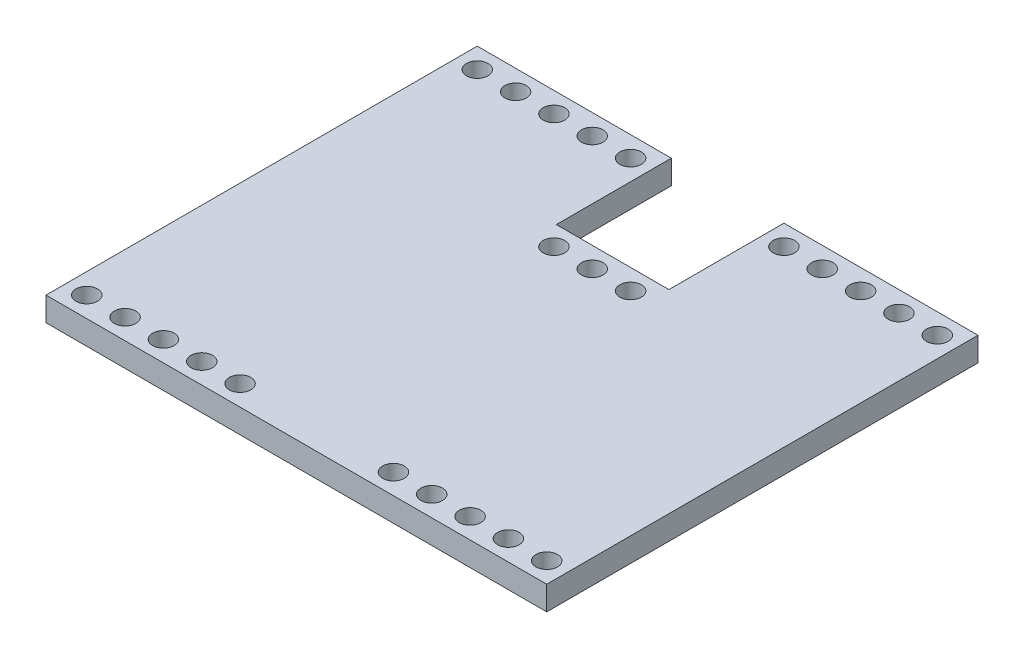
ISO-10303-21;
HEADER;
FILE_DESCRIPTION(('STEP AP214'),'2;1');
FILE_NAME('part.step','',(''),(''),'','','');
FILE_SCHEMA(('AUTOMOTIVE_DESIGN { 1 0 10303 214 1 1 1 1 }'));
ENDSEC;
DATA;
#1=APPLICATION_CONTEXT('core data for automotive mechanical design processes');
#2=APPLICATION_PROTOCOL_DEFINITION('international standard','automotive_design',2000,#1);
#3=PRODUCT_CONTEXT('',#1,'mechanical');
#4=PRODUCT('Part','Part','',(#3));
#5=PRODUCT_RELATED_PRODUCT_CATEGORY('part','',(#4));
#6=PRODUCT_DEFINITION_FORMATION('','',#4);
#7=PRODUCT_DEFINITION_CONTEXT('part definition',#1,'design');
#8=PRODUCT_DEFINITION('design','',#6,#7);
#9=PRODUCT_DEFINITION_SHAPE('','',#8);
#10=(LENGTH_UNIT() NAMED_UNIT(*) SI_UNIT(.MILLI.,.METRE.));
#11=(NAMED_UNIT(*) PLANE_ANGLE_UNIT() SI_UNIT($,.RADIAN.));
#12=(NAMED_UNIT(*) SI_UNIT($,.STERADIAN.) SOLID_ANGLE_UNIT());
#13=UNCERTAINTY_MEASURE_WITH_UNIT(LENGTH_MEASURE(1.E-05),#10,'distance_accuracy_value','');
#14=(GEOMETRIC_REPRESENTATION_CONTEXT(3) GLOBAL_UNCERTAINTY_ASSIGNED_CONTEXT((#13)) GLOBAL_UNIT_ASSIGNED_CONTEXT((#10,
#11,#12)) REPRESENTATION_CONTEXT('',''));
#15=CARTESIAN_POINT('',(0.,0.,0.));
#16=DIRECTION('',(0.,0.,1.));
#17=DIRECTION('',(1.,0.,0.));
#18=AXIS2_PLACEMENT_3D('',#15,#16,#17);
#19=CARTESIAN_POINT('',(11.75,5.,0.));
#20=DIRECTION('',(-1.,0.,0.));
#21=DIRECTION('',(0.,0.,1.));
#22=AXIS2_PLACEMENT_3D('',#19,#20,#21);
#23=PLANE('',#22);
#24=DIRECTION('',(0.,0.,-1.));
#25=VECTOR('',#24,1.);
#26=CARTESIAN_POINT('',(11.75,0.,0.));
#27=LINE('',#26,#25);
#28=CARTESIAN_POINT('',(11.75,0.,-21.));
#29=VERTEX_POINT('',#28);
#30=CARTESIAN_POINT('',(11.75,0.,-45.));
#31=VERTEX_POINT('',#30);
#32=EDGE_CURVE('E202',#29,#31,#27,.T.);
#33=ORIENTED_EDGE('',*,*,#32,.F.);
#34=DIRECTION('',(0.,-1.,0.));
#35=VECTOR('',#34,1.);
#36=CARTESIAN_POINT('',(11.75,5.,-21.));
#37=LINE('',#36,#35);
#38=CARTESIAN_POINT('',(11.75,5.,-21.));
#39=VERTEX_POINT('',#38);
#40=EDGE_CURVE('E11',#39,#29,#37,.T.);
#41=ORIENTED_EDGE('',*,*,#40,.F.);
#42=DIRECTION('',(0.,0.,-1.));
#43=VECTOR('',#42,1.);
#44=CARTESIAN_POINT('',(11.75,5.,0.));
#45=LINE('',#44,#43);
#46=CARTESIAN_POINT('',(11.75,5.,-45.));
#47=VERTEX_POINT('',#46);
#48=EDGE_CURVE('E707',#39,#47,#45,.T.);
#49=ORIENTED_EDGE('',*,*,#48,.T.);
#50=DIRECTION('',(0.,-1.,0.));
#51=VECTOR('',#50,1.);
#52=CARTESIAN_POINT('',(11.75,5.,-45.));
#53=LINE('',#52,#51);
#54=EDGE_CURVE('E54',#47,#31,#53,.T.);
#55=ORIENTED_EDGE('',*,*,#54,.T.);
#56=EDGE_LOOP('',(#33,#41,#49,#55));
#57=FACE_BOUND('',#56,.T.);
#58=ADVANCED_FACE('F37',(#57),#23,.T.);
#59=CARTESIAN_POINT('',(0.,5.,-21.));
#60=DIRECTION('',(0.,0.,-1.));
#61=DIRECTION('',(-1.,0.,0.));
#62=AXIS2_PLACEMENT_3D('',#59,#60,#61);
#63=PLANE('',#62);
#64=DIRECTION('',(1.,0.,0.));
#65=VECTOR('',#64,1.);
#66=CARTESIAN_POINT('',(0.,0.,-21.));
#67=LINE('',#66,#65);
#68=CARTESIAN_POINT('',(-11.75,0.,-21.));
#69=VERTEX_POINT('',#68);
#70=EDGE_CURVE('E204',#69,#29,#67,.T.);
#71=ORIENTED_EDGE('',*,*,#70,.F.);
#72=DIRECTION('',(0.,-1.,0.));
#73=VECTOR('',#72,1.);
#74=CARTESIAN_POINT('',(-11.75,5.,-21.));
#75=LINE('',#74,#73);
#76=CARTESIAN_POINT('',(-11.75,5.,-21.));
#77=VERTEX_POINT('',#76);
#78=EDGE_CURVE('E46',#77,#69,#75,.T.);
#79=ORIENTED_EDGE('',*,*,#78,.F.);
#80=DIRECTION('',(1.,0.,0.));
#81=VECTOR('',#80,1.);
#82=CARTESIAN_POINT('',(0.,5.,-21.));
#83=LINE('',#82,#81);
#84=EDGE_CURVE('E291',#77,#39,#83,.T.);
#85=ORIENTED_EDGE('',*,*,#84,.T.);
#86=ORIENTED_EDGE('',*,*,#40,.T.);
#87=EDGE_LOOP('',(#71,#79,#85,#86));
#88=FACE_BOUND('',#87,.T.);
#89=ADVANCED_FACE('F290',(#88),#63,.T.);
#90=CARTESIAN_POINT('',(-11.75,5.,0.));
#91=DIRECTION('',(-1.,0.,0.));
#92=DIRECTION('',(0.,0.,1.));
#93=AXIS2_PLACEMENT_3D('',#90,#91,#92);
#94=PLANE('',#93);
#95=DIRECTION('',(0.,0.,-1.));
#96=VECTOR('',#95,1.);
#97=CARTESIAN_POINT('',(-11.75,0.,0.));
#98=LINE('',#97,#96);
#99=CARTESIAN_POINT('',(-11.75,0.,-45.));
#100=VERTEX_POINT('',#99);
#101=EDGE_CURVE('E207',#69,#100,#98,.T.);
#102=ORIENTED_EDGE('',*,*,#101,.T.);
#103=DIRECTION('',(0.,-1.,0.));
#104=VECTOR('',#103,1.);
#105=CARTESIAN_POINT('',(-11.75,5.,-45.));
#106=LINE('',#105,#104);
#107=CARTESIAN_POINT('',(-11.75,5.,-45.));
#108=VERTEX_POINT('',#107);
#109=EDGE_CURVE('E274',#108,#100,#106,.T.);
#110=ORIENTED_EDGE('',*,*,#109,.F.);
#111=DIRECTION('',(0.,0.,-1.));
#112=VECTOR('',#111,1.);
#113=CARTESIAN_POINT('',(-11.75,5.,0.));
#114=LINE('',#113,#112);
#115=EDGE_CURVE('E280',#77,#108,#114,.T.);
#116=ORIENTED_EDGE('',*,*,#115,.F.);
#117=ORIENTED_EDGE('',*,*,#78,.T.);
#118=EDGE_LOOP('',(#102,#110,#116,#117));
#119=FACE_BOUND('',#118,.T.);
#120=ADVANCED_FACE('F278',(#119),#94,.F.);
#121=CARTESIAN_POINT('',(0.,5.,-45.));
#122=DIRECTION('',(0.,0.,-1.));
#123=DIRECTION('',(-1.,0.,0.));
#124=AXIS2_PLACEMENT_3D('',#121,#122,#123);
#125=PLANE('',#124);
#126=DIRECTION('',(1.,0.,0.));
#127=VECTOR('',#126,1.);
#128=CARTESIAN_POINT('',(0.,0.,-45.));
#129=LINE('',#128,#127);
#130=CARTESIAN_POINT('',(-52.25,0.,-45.));
#131=VERTEX_POINT('',#130);
#132=EDGE_CURVE('E210',#131,#100,#129,.T.);
#133=ORIENTED_EDGE('',*,*,#132,.F.);
#134=DIRECTION('',(0.,-1.,0.));
#135=VECTOR('',#134,1.);
#136=CARTESIAN_POINT('',(-52.25,5.,-45.));
#137=LINE('',#136,#135);
#138=CARTESIAN_POINT('',(-52.25,5.,-45.));
#139=VERTEX_POINT('',#138);
#140=EDGE_CURVE('E272',#139,#131,#137,.T.);
#141=ORIENTED_EDGE('',*,*,#140,.F.);
#142=DIRECTION('',(1.,0.,0.));
#143=VECTOR('',#142,1.);
#144=CARTESIAN_POINT('',(0.,5.,-45.));
#145=LINE('',#144,#143);
#146=EDGE_CURVE('E131',#139,#108,#145,.T.);
#147=ORIENTED_EDGE('',*,*,#146,.T.);
#148=ORIENTED_EDGE('',*,*,#109,.T.);
#149=EDGE_LOOP('',(#133,#141,#147,#148));
#150=FACE_BOUND('',#149,.T.);
#151=ADVANCED_FACE('F298',(#150),#125,.T.);
#152=CARTESIAN_POINT('',(-52.25,5.,0.));
#153=DIRECTION('',(1.,0.,0.));
#154=DIRECTION('',(0.,0.,-1.));
#155=AXIS2_PLACEMENT_3D('',#152,#153,#154);
#156=PLANE('',#155);
#157=DIRECTION('',(0.,0.,1.));
#158=VECTOR('',#157,1.);
#159=CARTESIAN_POINT('',(-52.25,0.,0.));
#160=LINE('',#159,#158);
#161=CARTESIAN_POINT('',(-52.25,0.,45.));
#162=VERTEX_POINT('',#161);
#163=EDGE_CURVE('E213',#131,#162,#160,.T.);
#164=ORIENTED_EDGE('',*,*,#163,.T.);
#165=DIRECTION('',(0.,-1.,0.));
#166=VECTOR('',#165,1.);
#167=CARTESIAN_POINT('',(-52.25,5.,45.));
#168=LINE('',#167,#166);
#169=CARTESIAN_POINT('',(-52.25,5.,45.));
#170=VERTEX_POINT('',#169);
#171=EDGE_CURVE('E124',#170,#162,#168,.T.);
#172=ORIENTED_EDGE('',*,*,#171,.F.);
#173=DIRECTION('',(0.,0.,1.));
#174=VECTOR('',#173,1.);
#175=CARTESIAN_POINT('',(-52.25,5.,0.));
#176=LINE('',#175,#174);
#177=EDGE_CURVE('E113',#139,#170,#176,.T.);
#178=ORIENTED_EDGE('',*,*,#177,.F.);
#179=ORIENTED_EDGE('',*,*,#140,.T.);
#180=EDGE_LOOP('',(#164,#172,#178,#179));
#181=FACE_BOUND('',#180,.T.);
#182=ADVANCED_FACE('F311',(#181),#156,.F.);
#183=CARTESIAN_POINT('',(0.,5.,45.));
#184=DIRECTION('',(0.,0.,-1.));
#185=DIRECTION('',(-1.,0.,0.));
#186=AXIS2_PLACEMENT_3D('',#183,#184,#185);
#187=PLANE('',#186);
#188=DIRECTION('',(1.,0.,0.));
#189=VECTOR('',#188,1.);
#190=CARTESIAN_POINT('',(0.,0.,45.));
#191=LINE('',#190,#189);
#192=CARTESIAN_POINT('',(52.25,0.,45.));
#193=VERTEX_POINT('',#192);
#194=EDGE_CURVE('E121',#162,#193,#191,.T.);
#195=ORIENTED_EDGE('',*,*,#194,.T.);
#196=DIRECTION('',(0.,-1.,0.));
#197=VECTOR('',#196,1.);
#198=CARTESIAN_POINT('',(52.25,5.,45.));
#199=LINE('',#198,#197);
#200=CARTESIAN_POINT('',(52.25,5.,45.));
#201=VERTEX_POINT('',#200);
#202=EDGE_CURVE('E119',#201,#193,#199,.T.);
#203=ORIENTED_EDGE('',*,*,#202,.F.);
#204=DIRECTION('',(1.,0.,0.));
#205=VECTOR('',#204,1.);
#206=CARTESIAN_POINT('',(0.,5.,45.));
#207=LINE('',#206,#205);
#208=EDGE_CURVE('E104',#170,#201,#207,.T.);
#209=ORIENTED_EDGE('',*,*,#208,.F.);
#210=ORIENTED_EDGE('',*,*,#171,.T.);
#211=EDGE_LOOP('',(#195,#203,#209,#210));
#212=FACE_BOUND('',#211,.T.);
#213=ADVANCED_FACE('F120',(#212),#187,.F.);
#214=CARTESIAN_POINT('',(52.25,5.,0.));
#215=DIRECTION('',(1.,0.,0.));
#216=DIRECTION('',(0.,0.,-1.));
#217=AXIS2_PLACEMENT_3D('',#214,#215,#216);
#218=PLANE('',#217);
#219=DIRECTION('',(0.,0.,1.));
#220=VECTOR('',#219,1.);
#221=CARTESIAN_POINT('',(52.25,0.,0.));
#222=LINE('',#221,#220);
#223=CARTESIAN_POINT('',(52.25,0.,-45.));
#224=VERTEX_POINT('',#223);
#225=EDGE_CURVE('E218',#224,#193,#222,.T.);
#226=ORIENTED_EDGE('',*,*,#225,.F.);
#227=DIRECTION('',(0.,-1.,0.));
#228=VECTOR('',#227,1.);
#229=CARTESIAN_POINT('',(52.25,5.,-45.));
#230=LINE('',#229,#228);
#231=CARTESIAN_POINT('',(52.25,5.,-45.));
#232=VERTEX_POINT('',#231);
#233=EDGE_CURVE('E79',#232,#224,#230,.T.);
#234=ORIENTED_EDGE('',*,*,#233,.F.);
#235=DIRECTION('',(0.,0.,1.));
#236=VECTOR('',#235,1.);
#237=CARTESIAN_POINT('',(52.25,5.,0.));
#238=LINE('',#237,#236);
#239=EDGE_CURVE('E110',#232,#201,#238,.T.);
#240=ORIENTED_EDGE('',*,*,#239,.T.);
#241=ORIENTED_EDGE('',*,*,#202,.T.);
#242=EDGE_LOOP('',(#226,#234,#240,#241));
#243=FACE_BOUND('',#242,.T.);
#244=ADVANCED_FACE('F126',(#243),#218,.T.);
#245=CARTESIAN_POINT('',(-32.,5.,40.75));
#246=DIRECTION('',(0.,-1.,0.));
#247=DIRECTION('',(0.,0.,-1.));
#248=AXIS2_PLACEMENT_3D('',#245,#246,#247);
#249=CYLINDRICAL_SURFACE('',#248,2.25);
#250=CARTESIAN_POINT('',(-32.,5.,40.75));
#251=DIRECTION('',(0.,1.,0.));
#252=DIRECTION('',(0.,0.,1.));
#253=AXIS2_PLACEMENT_3D('',#250,#251,#252);
#254=CIRCLE('',#253,2.25);
#255=CARTESIAN_POINT('',(-32.,5.,43.));
#256=VERTEX_POINT('',#255);
#257=EDGE_CURVE('E175',#256,#256,#254,.F.);
#258=ORIENTED_EDGE('',*,*,#257,.F.);
#259=EDGE_LOOP('',(#258));
#260=FACE_BOUND('',#259,.T.);
#261=CARTESIAN_POINT('',(-32.,0.,40.75));
#262=DIRECTION('',(0.,1.,0.));
#263=DIRECTION('',(0.,0.,1.));
#264=AXIS2_PLACEMENT_3D('',#261,#262,#263);
#265=CIRCLE('',#264,2.25);
#266=CARTESIAN_POINT('',(-32.,0.,43.));
#267=VERTEX_POINT('',#266);
#268=EDGE_CURVE('E262',#267,#267,#265,.F.);
#269=ORIENTED_EDGE('',*,*,#268,.T.);
#270=EDGE_LOOP('',(#269));
#271=FACE_BOUND('',#270,.T.);
#272=ADVANCED_FACE('F377',(#260,#271),#249,.F.);
#273=CARTESIAN_POINT('',(-16.,5.,40.75));
#274=DIRECTION('',(0.,-1.,0.));
#275=DIRECTION('',(0.,0.,-1.));
#276=AXIS2_PLACEMENT_3D('',#273,#274,#275);
#277=CYLINDRICAL_SURFACE('',#276,2.25);
#278=CARTESIAN_POINT('',(-16.,5.,40.75));
#279=DIRECTION('',(0.,1.,0.));
#280=DIRECTION('',(0.,0.,1.));
#281=AXIS2_PLACEMENT_3D('',#278,#279,#280);
#282=CIRCLE('',#281,2.25);
#283=CARTESIAN_POINT('',(-16.,5.,43.));
#284=VERTEX_POINT('',#283);
#285=EDGE_CURVE('E172',#284,#284,#282,.F.);
#286=ORIENTED_EDGE('',*,*,#285,.F.);
#287=EDGE_LOOP('',(#286));
#288=FACE_BOUND('',#287,.T.);
#289=CARTESIAN_POINT('',(-16.,0.,40.75));
#290=DIRECTION('',(0.,1.,0.));
#291=DIRECTION('',(0.,0.,1.));
#292=AXIS2_PLACEMENT_3D('',#289,#290,#291);
#293=CIRCLE('',#292,2.25);
#294=CARTESIAN_POINT('',(-16.,0.,43.));
#295=VERTEX_POINT('',#294);
#296=EDGE_CURVE('E259',#295,#295,#293,.F.);
#297=ORIENTED_EDGE('',*,*,#296,.T.);
#298=EDGE_LOOP('',(#297));
#299=FACE_BOUND('',#298,.T.);
#300=ADVANCED_FACE('F380',(#288,#299),#277,.F.);
#301=CARTESIAN_POINT('',(15.9999999999999,5.,40.75));
#302=DIRECTION('',(0.,-1.,0.));
#303=DIRECTION('',(0.,0.,-1.));
#304=AXIS2_PLACEMENT_3D('',#301,#302,#303);
#305=CYLINDRICAL_SURFACE('',#304,2.25);
#306=CARTESIAN_POINT('',(15.9999999999999,5.,40.75));
#307=DIRECTION('',(0.,1.,0.));
#308=DIRECTION('',(0.,0.,1.));
#309=AXIS2_PLACEMENT_3D('',#306,#307,#308);
#310=CIRCLE('',#309,2.25);
#311=CARTESIAN_POINT('',(15.9999999999999,5.,43.));
#312=VERTEX_POINT('',#311);
#313=EDGE_CURVE('E169',#312,#312,#310,.T.);
#314=ORIENTED_EDGE('',*,*,#313,.T.);
#315=EDGE_LOOP('',(#314));
#316=FACE_BOUND('',#315,.T.);
#317=CARTESIAN_POINT('',(15.9999999999999,0.,40.75));
#318=DIRECTION('',(0.,1.,0.));
#319=DIRECTION('',(0.,0.,1.));
#320=AXIS2_PLACEMENT_3D('',#317,#318,#319);
#321=CIRCLE('',#320,2.25);
#322=CARTESIAN_POINT('',(15.9999999999999,0.,43.));
#323=VERTEX_POINT('',#322);
#324=EDGE_CURVE('E256',#323,#323,#321,.T.);
#325=ORIENTED_EDGE('',*,*,#324,.F.);
#326=EDGE_LOOP('',(#325));
#327=FACE_BOUND('',#326,.T.);
#328=ADVANCED_FACE('F384',(#316,#327),#305,.F.);
#329=CARTESIAN_POINT('',(23.9999999999999,5.,40.75));
#330=DIRECTION('',(0.,-1.,0.));
#331=DIRECTION('',(0.,0.,-1.));
#332=AXIS2_PLACEMENT_3D('',#329,#330,#331);
#333=CYLINDRICAL_SURFACE('',#332,2.25);
#334=CARTESIAN_POINT('',(23.9999999999999,5.,40.75));
#335=DIRECTION('',(0.,1.,0.));
#336=DIRECTION('',(0.,0.,1.));
#337=AXIS2_PLACEMENT_3D('',#334,#335,#336);
#338=CIRCLE('',#337,2.25);
#339=CARTESIAN_POINT('',(23.9999999999999,5.,43.));
#340=VERTEX_POINT('',#339);
#341=EDGE_CURVE('E166',#340,#340,#338,.T.);
#342=ORIENTED_EDGE('',*,*,#341,.T.);
#343=EDGE_LOOP('',(#342));
#344=FACE_BOUND('',#343,.T.);
#345=CARTESIAN_POINT('',(23.9999999999999,0.,40.75));
#346=DIRECTION('',(0.,1.,0.));
#347=DIRECTION('',(0.,0.,1.));
#348=AXIS2_PLACEMENT_3D('',#345,#346,#347);
#349=CIRCLE('',#348,2.25);
#350=CARTESIAN_POINT('',(23.9999999999999,0.,43.));
#351=VERTEX_POINT('',#350);
#352=EDGE_CURVE('E253',#351,#351,#349,.T.);
#353=ORIENTED_EDGE('',*,*,#352,.F.);
#354=EDGE_LOOP('',(#353));
#355=FACE_BOUND('',#354,.T.);
#356=ADVANCED_FACE('F388',(#344,#355),#333,.F.);
#357=CARTESIAN_POINT('',(31.9999999999999,5.,40.75));
#358=DIRECTION('',(0.,-1.,0.));
#359=DIRECTION('',(0.,0.,-1.));
#360=AXIS2_PLACEMENT_3D('',#357,#358,#359);
#361=CYLINDRICAL_SURFACE('',#360,2.25);
#362=CARTESIAN_POINT('',(31.9999999999999,5.,40.75));
#363=DIRECTION('',(0.,1.,0.));
#364=DIRECTION('',(0.,0.,1.));
#365=AXIS2_PLACEMENT_3D('',#362,#363,#364);
#366=CIRCLE('',#365,2.25);
#367=CARTESIAN_POINT('',(31.9999999999999,5.,43.));
#368=VERTEX_POINT('',#367);
#369=EDGE_CURVE('E163',#368,#368,#366,.T.);
#370=ORIENTED_EDGE('',*,*,#369,.T.);
#371=EDGE_LOOP('',(#370));
#372=FACE_BOUND('',#371,.T.);
#373=CARTESIAN_POINT('',(31.9999999999999,0.,40.75));
#374=DIRECTION('',(0.,1.,0.));
#375=DIRECTION('',(0.,0.,1.));
#376=AXIS2_PLACEMENT_3D('',#373,#374,#375);
#377=CIRCLE('',#376,2.25);
#378=CARTESIAN_POINT('',(31.9999999999999,0.,43.));
#379=VERTEX_POINT('',#378);
#380=EDGE_CURVE('E250',#379,#379,#377,.T.);
#381=ORIENTED_EDGE('',*,*,#380,.F.);
#382=EDGE_LOOP('',(#381));
#383=FACE_BOUND('',#382,.T.);
#384=ADVANCED_FACE('F392',(#372,#383),#361,.F.);
#385=CARTESIAN_POINT('',(39.9999999999999,5.,40.75));
#386=DIRECTION('',(0.,-1.,0.));
#387=DIRECTION('',(0.,0.,-1.));
#388=AXIS2_PLACEMENT_3D('',#385,#386,#387);
#389=CYLINDRICAL_SURFACE('',#388,2.25);
#390=CARTESIAN_POINT('',(39.9999999999999,5.,40.75));
#391=DIRECTION('',(0.,1.,0.));
#392=DIRECTION('',(0.,0.,1.));
#393=AXIS2_PLACEMENT_3D('',#390,#391,#392);
#394=CIRCLE('',#393,2.25);
#395=CARTESIAN_POINT('',(39.9999999999999,5.,43.));
#396=VERTEX_POINT('',#395);
#397=EDGE_CURVE('E160',#396,#396,#394,.T.);
#398=ORIENTED_EDGE('',*,*,#397,.T.);
#399=EDGE_LOOP('',(#398));
#400=FACE_BOUND('',#399,.T.);
#401=CARTESIAN_POINT('',(39.9999999999999,0.,40.75));
#402=DIRECTION('',(0.,1.,0.));
#403=DIRECTION('',(0.,0.,1.));
#404=AXIS2_PLACEMENT_3D('',#401,#402,#403);
#405=CIRCLE('',#404,2.25);
#406=CARTESIAN_POINT('',(39.9999999999999,0.,43.));
#407=VERTEX_POINT('',#406);
#408=EDGE_CURVE('E247',#407,#407,#405,.T.);
#409=ORIENTED_EDGE('',*,*,#408,.F.);
#410=EDGE_LOOP('',(#409));
#411=FACE_BOUND('',#410,.T.);
#412=ADVANCED_FACE('F396',(#400,#411),#389,.F.);
#413=CARTESIAN_POINT('',(47.9999999999999,5.,40.75));
#414=DIRECTION('',(0.,-1.,0.));
#415=DIRECTION('',(0.,0.,-1.));
#416=AXIS2_PLACEMENT_3D('',#413,#414,#415);
#417=CYLINDRICAL_SURFACE('',#416,2.25);
#418=CARTESIAN_POINT('',(47.9999999999999,5.,40.75));
#419=DIRECTION('',(0.,1.,0.));
#420=DIRECTION('',(0.,0.,1.));
#421=AXIS2_PLACEMENT_3D('',#418,#419,#420);
#422=CIRCLE('',#421,2.25);
#423=CARTESIAN_POINT('',(47.9999999999999,5.,43.));
#424=VERTEX_POINT('',#423);
#425=EDGE_CURVE('E157',#424,#424,#422,.T.);
#426=ORIENTED_EDGE('',*,*,#425,.T.);
#427=EDGE_LOOP('',(#426));
#428=FACE_BOUND('',#427,.T.);
#429=CARTESIAN_POINT('',(47.9999999999999,0.,40.75));
#430=DIRECTION('',(0.,1.,0.));
#431=DIRECTION('',(0.,0.,1.));
#432=AXIS2_PLACEMENT_3D('',#429,#430,#431);
#433=CIRCLE('',#432,2.25);
#434=CARTESIAN_POINT('',(47.9999999999999,0.,43.));
#435=VERTEX_POINT('',#434);
#436=EDGE_CURVE('E244',#435,#435,#433,.T.);
#437=ORIENTED_EDGE('',*,*,#436,.F.);
#438=EDGE_LOOP('',(#437));
#439=FACE_BOUND('',#438,.T.);
#440=ADVANCED_FACE('F400',(#428,#439),#417,.F.);
#441=CARTESIAN_POINT('',(16.,5.,-40.75));
#442=DIRECTION('',(0.,-1.,0.));
#443=DIRECTION('',(0.,0.,-1.));
#444=AXIS2_PLACEMENT_3D('',#441,#442,#443);
#445=CYLINDRICAL_SURFACE('',#444,2.25);
#446=CARTESIAN_POINT('',(16.,5.,-40.75));
#447=DIRECTION('',(0.,1.,0.));
#448=DIRECTION('',(0.,0.,1.));
#449=AXIS2_PLACEMENT_3D('',#446,#447,#448);
#450=CIRCLE('',#449,2.25);
#451=CARTESIAN_POINT('',(16.,5.,-38.5));
#452=VERTEX_POINT('',#451);
#453=EDGE_CURVE('E154',#452,#452,#450,.F.);
#454=ORIENTED_EDGE('',*,*,#453,.F.);
#455=EDGE_LOOP('',(#454));
#456=FACE_BOUND('',#455,.T.);
#457=CARTESIAN_POINT('',(16.,0.,-40.75));
#458=DIRECTION('',(0.,1.,0.));
#459=DIRECTION('',(0.,0.,1.));
#460=AXIS2_PLACEMENT_3D('',#457,#458,#459);
#461=CIRCLE('',#460,2.25);
#462=CARTESIAN_POINT('',(16.,0.,-38.5));
#463=VERTEX_POINT('',#462);
#464=EDGE_CURVE('E241',#463,#463,#461,.F.);
#465=ORIENTED_EDGE('',*,*,#464,.T.);
#466=EDGE_LOOP('',(#465));
#467=FACE_BOUND('',#466,.T.);
#468=ADVANCED_FACE('F404',(#456,#467),#445,.F.);
#469=CARTESIAN_POINT('',(32.,5.,-40.75));
#470=DIRECTION('',(0.,-1.,0.));
#471=DIRECTION('',(0.,0.,-1.));
#472=AXIS2_PLACEMENT_3D('',#469,#470,#471);
#473=CYLINDRICAL_SURFACE('',#472,2.25);
#474=CARTESIAN_POINT('',(32.,5.,-40.75));
#475=DIRECTION('',(0.,1.,0.));
#476=DIRECTION('',(0.,0.,1.));
#477=AXIS2_PLACEMENT_3D('',#474,#475,#476);
#478=CIRCLE('',#477,2.25);
#479=CARTESIAN_POINT('',(32.,5.,-38.5));
#480=VERTEX_POINT('',#479);
#481=EDGE_CURVE('E151',#480,#480,#478,.F.);
#482=ORIENTED_EDGE('',*,*,#481,.F.);
#483=EDGE_LOOP('',(#482));
#484=FACE_BOUND('',#483,.T.);
#485=CARTESIAN_POINT('',(32.,0.,-40.75));
#486=DIRECTION('',(0.,1.,0.));
#487=DIRECTION('',(0.,0.,1.));
#488=AXIS2_PLACEMENT_3D('',#485,#486,#487);
#489=CIRCLE('',#488,2.25);
#490=CARTESIAN_POINT('',(32.,0.,-38.5));
#491=VERTEX_POINT('',#490);
#492=EDGE_CURVE('E238',#491,#491,#489,.F.);
#493=ORIENTED_EDGE('',*,*,#492,.T.);
#494=EDGE_LOOP('',(#493));
#495=FACE_BOUND('',#494,.T.);
#496=ADVANCED_FACE('F408',(#484,#495),#473,.F.);
#497=CARTESIAN_POINT('',(48.,5.,-40.75));
#498=DIRECTION('',(0.,-1.,0.));
#499=DIRECTION('',(0.,0.,-1.));
#500=AXIS2_PLACEMENT_3D('',#497,#498,#499);
#501=CYLINDRICAL_SURFACE('',#500,2.25);
#502=CARTESIAN_POINT('',(48.,5.,-40.75));
#503=DIRECTION('',(0.,1.,0.));
#504=DIRECTION('',(0.,0.,1.));
#505=AXIS2_PLACEMENT_3D('',#502,#503,#504);
#506=CIRCLE('',#505,2.25);
#507=CARTESIAN_POINT('',(48.,5.,-38.5));
#508=VERTEX_POINT('',#507);
#509=EDGE_CURVE('E148',#508,#508,#506,.F.);
#510=ORIENTED_EDGE('',*,*,#509,.F.);
#511=EDGE_LOOP('',(#510));
#512=FACE_BOUND('',#511,.T.);
#513=CARTESIAN_POINT('',(48.,0.,-40.75));
#514=DIRECTION('',(0.,1.,0.));
#515=DIRECTION('',(0.,0.,1.));
#516=AXIS2_PLACEMENT_3D('',#513,#514,#515);
#517=CIRCLE('',#516,2.25);
#518=CARTESIAN_POINT('',(48.,0.,-38.5));
#519=VERTEX_POINT('',#518);
#520=EDGE_CURVE('E235',#519,#519,#517,.F.);
#521=ORIENTED_EDGE('',*,*,#520,.T.);
#522=EDGE_LOOP('',(#521));
#523=FACE_BOUND('',#522,.T.);
#524=ADVANCED_FACE('F412',(#512,#523),#501,.F.);
#525=CARTESIAN_POINT('',(-16.,5.,-40.75));
#526=DIRECTION('',(0.,-1.,0.));
#527=DIRECTION('',(0.,0.,-1.));
#528=AXIS2_PLACEMENT_3D('',#525,#526,#527);
#529=CYLINDRICAL_SURFACE('',#528,2.25);
#530=CARTESIAN_POINT('',(-16.,5.,-40.75));
#531=DIRECTION('',(0.,1.,0.));
#532=DIRECTION('',(0.,0.,1.));
#533=AXIS2_PLACEMENT_3D('',#530,#531,#532);
#534=CIRCLE('',#533,2.25);
#535=CARTESIAN_POINT('',(-16.,5.,-38.5));
#536=VERTEX_POINT('',#535);
#537=EDGE_CURVE('E145',#536,#536,#534,.T.);
#538=ORIENTED_EDGE('',*,*,#537,.T.);
#539=EDGE_LOOP('',(#538));
#540=FACE_BOUND('',#539,.T.);
#541=CARTESIAN_POINT('',(-16.,0.,-40.75));
#542=DIRECTION('',(0.,1.,0.));
#543=DIRECTION('',(0.,0.,1.));
#544=AXIS2_PLACEMENT_3D('',#541,#542,#543);
#545=CIRCLE('',#544,2.25);
#546=CARTESIAN_POINT('',(-16.,0.,-38.5));
#547=VERTEX_POINT('',#546);
#548=EDGE_CURVE('E232',#547,#547,#545,.T.);
#549=ORIENTED_EDGE('',*,*,#548,.F.);
#550=EDGE_LOOP('',(#549));
#551=FACE_BOUND('',#550,.T.);
#552=ADVANCED_FACE('F416',(#540,#551),#529,.F.);
#553=CARTESIAN_POINT('',(-24.,5.,-40.75));
#554=DIRECTION('',(0.,-1.,0.));
#555=DIRECTION('',(0.,0.,-1.));
#556=AXIS2_PLACEMENT_3D('',#553,#554,#555);
#557=CYLINDRICAL_SURFACE('',#556,2.25);
#558=CARTESIAN_POINT('',(-24.,5.,-40.75));
#559=DIRECTION('',(0.,1.,0.));
#560=DIRECTION('',(0.,0.,1.));
#561=AXIS2_PLACEMENT_3D('',#558,#559,#560);
#562=CIRCLE('',#561,2.25);
#563=CARTESIAN_POINT('',(-24.,5.,-38.5));
#564=VERTEX_POINT('',#563);
#565=EDGE_CURVE('E142',#564,#564,#562,.T.);
#566=ORIENTED_EDGE('',*,*,#565,.T.);
#567=EDGE_LOOP('',(#566));
#568=FACE_BOUND('',#567,.T.);
#569=CARTESIAN_POINT('',(-24.,0.,-40.75));
#570=DIRECTION('',(0.,1.,0.));
#571=DIRECTION('',(0.,0.,1.));
#572=AXIS2_PLACEMENT_3D('',#569,#570,#571);
#573=CIRCLE('',#572,2.25);
#574=CARTESIAN_POINT('',(-24.,0.,-38.5));
#575=VERTEX_POINT('',#574);
#576=EDGE_CURVE('E229',#575,#575,#573,.T.);
#577=ORIENTED_EDGE('',*,*,#576,.F.);
#578=EDGE_LOOP('',(#577));
#579=FACE_BOUND('',#578,.T.);
#580=ADVANCED_FACE('F420',(#568,#579),#557,.F.);
#581=CARTESIAN_POINT('',(-32.,5.,-40.75));
#582=DIRECTION('',(0.,-1.,0.));
#583=DIRECTION('',(0.,0.,-1.));
#584=AXIS2_PLACEMENT_3D('',#581,#582,#583);
#585=CYLINDRICAL_SURFACE('',#584,2.25);
#586=CARTESIAN_POINT('',(-32.,5.,-40.75));
#587=DIRECTION('',(0.,1.,0.));
#588=DIRECTION('',(0.,0.,1.));
#589=AXIS2_PLACEMENT_3D('',#586,#587,#588);
#590=CIRCLE('',#589,2.25);
#591=CARTESIAN_POINT('',(-32.,5.,-38.5));
#592=VERTEX_POINT('',#591);
#593=EDGE_CURVE('E139',#592,#592,#590,.T.);
#594=ORIENTED_EDGE('',*,*,#593,.T.);
#595=EDGE_LOOP('',(#594));
#596=FACE_BOUND('',#595,.T.);
#597=CARTESIAN_POINT('',(-32.,0.,-40.75));
#598=DIRECTION('',(0.,1.,0.));
#599=DIRECTION('',(0.,0.,1.));
#600=AXIS2_PLACEMENT_3D('',#597,#598,#599);
#601=CIRCLE('',#600,2.25);
#602=CARTESIAN_POINT('',(-32.,0.,-38.5));
#603=VERTEX_POINT('',#602);
#604=EDGE_CURVE('E226',#603,#603,#601,.T.);
#605=ORIENTED_EDGE('',*,*,#604,.F.);
#606=EDGE_LOOP('',(#605));
#607=FACE_BOUND('',#606,.T.);
#608=ADVANCED_FACE('F424',(#596,#607),#585,.F.);
#609=CARTESIAN_POINT('',(-40.,5.,-40.75));
#610=DIRECTION('',(0.,-1.,0.));
#611=DIRECTION('',(0.,0.,-1.));
#612=AXIS2_PLACEMENT_3D('',#609,#610,#611);
#613=CYLINDRICAL_SURFACE('',#612,2.25);
#614=CARTESIAN_POINT('',(-40.,5.,-40.75));
#615=DIRECTION('',(0.,1.,0.));
#616=DIRECTION('',(0.,0.,1.));
#617=AXIS2_PLACEMENT_3D('',#614,#615,#616);
#618=CIRCLE('',#617,2.25);
#619=CARTESIAN_POINT('',(-40.,5.,-38.5));
#620=VERTEX_POINT('',#619);
#621=EDGE_CURVE('E136',#620,#620,#618,.T.);
#622=ORIENTED_EDGE('',*,*,#621,.T.);
#623=EDGE_LOOP('',(#622));
#624=FACE_BOUND('',#623,.T.);
#625=CARTESIAN_POINT('',(-40.,0.,-40.75));
#626=DIRECTION('',(0.,1.,0.));
#627=DIRECTION('',(0.,0.,1.));
#628=AXIS2_PLACEMENT_3D('',#625,#626,#627);
#629=CIRCLE('',#628,2.25);
#630=CARTESIAN_POINT('',(-40.,0.,-38.5));
#631=VERTEX_POINT('',#630);
#632=EDGE_CURVE('E223',#631,#631,#629,.T.);
#633=ORIENTED_EDGE('',*,*,#632,.F.);
#634=EDGE_LOOP('',(#633));
#635=FACE_BOUND('',#634,.T.);
#636=ADVANCED_FACE('F306',(#624,#635),#613,.F.);
#637=CARTESIAN_POINT('',(-48.,5.,-40.75));
#638=DIRECTION('',(0.,-1.,0.));
#639=DIRECTION('',(0.,0.,-1.));
#640=AXIS2_PLACEMENT_3D('',#637,#638,#639);
#641=CYLINDRICAL_SURFACE('',#640,2.25);
#642=CARTESIAN_POINT('',(-48.,5.,-40.75));
#643=DIRECTION('',(0.,1.,0.));
#644=DIRECTION('',(0.,0.,1.));
#645=AXIS2_PLACEMENT_3D('',#642,#643,#644);
#646=CIRCLE('',#645,2.25);
#647=CARTESIAN_POINT('',(-48.,5.,-38.5));
#648=VERTEX_POINT('',#647);
#649=EDGE_CURVE('E129',#648,#648,#646,.T.);
#650=ORIENTED_EDGE('',*,*,#649,.T.);
#651=EDGE_LOOP('',(#650));
#652=FACE_BOUND('',#651,.T.);
#653=CARTESIAN_POINT('',(-48.,0.,-40.75));
#654=DIRECTION('',(0.,1.,0.));
#655=DIRECTION('',(0.,0.,1.));
#656=AXIS2_PLACEMENT_3D('',#653,#654,#655);
#657=CIRCLE('',#656,2.25);
#658=CARTESIAN_POINT('',(-48.,0.,-38.5));
#659=VERTEX_POINT('',#658);
#660=EDGE_CURVE('E220',#659,#659,#657,.T.);
#661=ORIENTED_EDGE('',*,*,#660,.F.);
#662=EDGE_LOOP('',(#661));
#663=FACE_BOUND('',#662,.T.);
#664=ADVANCED_FACE('F296',(#652,#663),#641,.F.);
#665=EDGE_CURVE('E214',#31,#224,#129,.T.);
#666=ORIENTED_EDGE('',*,*,#665,.F.);
#667=ORIENTED_EDGE('',*,*,#54,.F.);
#668=EDGE_CURVE('E127',#47,#232,#145,.T.);
#669=ORIENTED_EDGE('',*,*,#668,.T.);
#670=ORIENTED_EDGE('',*,*,#233,.T.);
#671=EDGE_LOOP('',(#666,#667,#669,#670));
#672=FACE_BOUND('',#671,.T.);
#673=ADVANCED_FACE('F293',(#672),#125,.T.);
#674=CARTESIAN_POINT('',(40.,5.,-40.75));
#675=DIRECTION('',(0.,-1.,0.));
#676=DIRECTION('',(0.,0.,-1.));
#677=AXIS2_PLACEMENT_3D('',#674,#675,#676);
#678=CYLINDRICAL_SURFACE('',#677,2.25);
#679=CARTESIAN_POINT('',(40.,5.,-40.75));
#680=DIRECTION('',(0.,1.,0.));
#681=DIRECTION('',(0.,0.,1.));
#682=AXIS2_PLACEMENT_3D('',#679,#680,#681);
#683=CIRCLE('',#682,2.25);
#684=CARTESIAN_POINT('',(40.,5.,-38.5));
#685=VERTEX_POINT('',#684);
#686=EDGE_CURVE('E709',#685,#685,#683,.F.);
#687=ORIENTED_EDGE('',*,*,#686,.F.);
#688=EDGE_LOOP('',(#687));
#689=FACE_BOUND('',#688,.T.);
#690=CARTESIAN_POINT('',(40.,0.,-40.75));
#691=DIRECTION('',(0.,1.,0.));
#692=DIRECTION('',(0.,0.,1.));
#693=AXIS2_PLACEMENT_3D('',#690,#691,#692);
#694=CIRCLE('',#693,2.25);
#695=CARTESIAN_POINT('',(40.,0.,-38.5));
#696=VERTEX_POINT('',#695);
#697=EDGE_CURVE('E199',#696,#696,#694,.F.);
#698=ORIENTED_EDGE('',*,*,#697,.T.);
#699=EDGE_LOOP('',(#698));
#700=FACE_BOUND('',#699,.T.);
#701=ADVANCED_FACE('F295',(#689,#700),#678,.F.);
#702=CARTESIAN_POINT('',(24.,5.,-40.75));
#703=DIRECTION('',(0.,-1.,0.));
#704=DIRECTION('',(0.,0.,-1.));
#705=AXIS2_PLACEMENT_3D('',#702,#703,#704);
#706=CYLINDRICAL_SURFACE('',#705,2.25);
#707=CARTESIAN_POINT('',(24.,5.,-40.75));
#708=DIRECTION('',(0.,1.,0.));
#709=DIRECTION('',(0.,0.,1.));
#710=AXIS2_PLACEMENT_3D('',#707,#708,#709);
#711=CIRCLE('',#710,2.25);
#712=CARTESIAN_POINT('',(24.,5.,-38.5));
#713=VERTEX_POINT('',#712);
#714=EDGE_CURVE('E712',#713,#713,#711,.F.);
#715=ORIENTED_EDGE('',*,*,#714,.F.);
#716=EDGE_LOOP('',(#715));
#717=FACE_BOUND('',#716,.T.);
#718=CARTESIAN_POINT('',(24.,0.,-40.75));
#719=DIRECTION('',(0.,1.,0.));
#720=DIRECTION('',(0.,0.,1.));
#721=AXIS2_PLACEMENT_3D('',#718,#719,#720);
#722=CIRCLE('',#721,2.25);
#723=CARTESIAN_POINT('',(24.,0.,-38.5));
#724=VERTEX_POINT('',#723);
#725=EDGE_CURVE('E196',#724,#724,#722,.F.);
#726=ORIENTED_EDGE('',*,*,#725,.T.);
#727=EDGE_LOOP('',(#726));
#728=FACE_BOUND('',#727,.T.);
#729=ADVANCED_FACE('F303',(#717,#728),#706,.F.);
#730=CARTESIAN_POINT('',(-8.,5.,-16.75));
#731=DIRECTION('',(0.,-1.,0.));
#732=DIRECTION('',(0.,0.,-1.));
#733=AXIS2_PLACEMENT_3D('',#730,#731,#732);
#734=CYLINDRICAL_SURFACE('',#733,2.25);
#735=CARTESIAN_POINT('',(-8.,5.,-16.75));
#736=DIRECTION('',(0.,1.,0.));
#737=DIRECTION('',(0.,0.,1.));
#738=AXIS2_PLACEMENT_3D('',#735,#736,#737);
#739=CIRCLE('',#738,2.25);
#740=CARTESIAN_POINT('',(-8.,5.,-14.5));
#741=VERTEX_POINT('',#740);
#742=EDGE_CURVE('E715',#741,#741,#739,.T.);
#743=ORIENTED_EDGE('',*,*,#742,.T.);
#744=EDGE_LOOP('',(#743));
#745=FACE_BOUND('',#744,.T.);
#746=CARTESIAN_POINT('',(-8.,0.,-16.75));
#747=DIRECTION('',(0.,1.,0.));
#748=DIRECTION('',(0.,0.,1.));
#749=AXIS2_PLACEMENT_3D('',#746,#747,#748);
#750=CIRCLE('',#749,2.25);
#751=CARTESIAN_POINT('',(-8.,0.,-14.5));
#752=VERTEX_POINT('',#751);
#753=EDGE_CURVE('E193',#752,#752,#750,.T.);
#754=ORIENTED_EDGE('',*,*,#753,.F.);
#755=EDGE_LOOP('',(#754));
#756=FACE_BOUND('',#755,.T.);
#757=ADVANCED_FACE('F323',(#745,#756),#734,.F.);
#758=CARTESIAN_POINT('',(0.,5.,-16.75));
#759=DIRECTION('',(0.,-1.,0.));
#760=DIRECTION('',(0.,0.,-1.));
#761=AXIS2_PLACEMENT_3D('',#758,#759,#760);
#762=CYLINDRICAL_SURFACE('',#761,2.25);
#763=CARTESIAN_POINT('',(0.,5.,-16.75));
#764=DIRECTION('',(0.,1.,0.));
#765=DIRECTION('',(0.,0.,1.));
#766=AXIS2_PLACEMENT_3D('',#763,#764,#765);
#767=CIRCLE('',#766,2.25);
#768=CARTESIAN_POINT('',(0.,5.,-14.5));
#769=VERTEX_POINT('',#768);
#770=EDGE_CURVE('E718',#769,#769,#767,.T.);
#771=ORIENTED_EDGE('',*,*,#770,.T.);
#772=EDGE_LOOP('',(#771));
#773=FACE_BOUND('',#772,.T.);
#774=CARTESIAN_POINT('',(0.,0.,-16.75));
#775=DIRECTION('',(0.,1.,0.));
#776=DIRECTION('',(0.,0.,1.));
#777=AXIS2_PLACEMENT_3D('',#774,#775,#776);
#778=CIRCLE('',#777,2.25);
#779=CARTESIAN_POINT('',(0.,0.,-14.5));
#780=VERTEX_POINT('',#779);
#781=EDGE_CURVE('E190',#780,#780,#778,.T.);
#782=ORIENTED_EDGE('',*,*,#781,.F.);
#783=EDGE_LOOP('',(#782));
#784=FACE_BOUND('',#783,.T.);
#785=ADVANCED_FACE('F327',(#773,#784),#762,.F.);
#786=CARTESIAN_POINT('',(8.,5.,-16.75));
#787=DIRECTION('',(0.,-1.,0.));
#788=DIRECTION('',(0.,0.,-1.));
#789=AXIS2_PLACEMENT_3D('',#786,#787,#788);
#790=CYLINDRICAL_SURFACE('',#789,2.25);
#791=CARTESIAN_POINT('',(8.,5.,-16.75));
#792=DIRECTION('',(0.,1.,0.));
#793=DIRECTION('',(0.,0.,1.));
#794=AXIS2_PLACEMENT_3D('',#791,#792,#793);
#795=CIRCLE('',#794,2.25);
#796=CARTESIAN_POINT('',(8.,5.,-14.5));
#797=VERTEX_POINT('',#796);
#798=EDGE_CURVE('E721',#797,#797,#795,.F.);
#799=ORIENTED_EDGE('',*,*,#798,.F.);
#800=EDGE_LOOP('',(#799));
#801=FACE_BOUND('',#800,.T.);
#802=CARTESIAN_POINT('',(8.,0.,-16.75));
#803=DIRECTION('',(0.,1.,0.));
#804=DIRECTION('',(0.,0.,1.));
#805=AXIS2_PLACEMENT_3D('',#802,#803,#804);
#806=CIRCLE('',#805,2.25);
#807=CARTESIAN_POINT('',(8.,0.,-14.5));
#808=VERTEX_POINT('',#807);
#809=EDGE_CURVE('E187',#808,#808,#806,.F.);
#810=ORIENTED_EDGE('',*,*,#809,.T.);
#811=EDGE_LOOP('',(#810));
#812=FACE_BOUND('',#811,.T.);
#813=ADVANCED_FACE('F331',(#801,#812),#790,.F.);
#814=CARTESIAN_POINT('',(-24.,5.,40.75));
#815=DIRECTION('',(0.,-1.,0.));
#816=DIRECTION('',(0.,0.,-1.));
#817=AXIS2_PLACEMENT_3D('',#814,#815,#816);
#818=CYLINDRICAL_SURFACE('',#817,2.25);
#819=CARTESIAN_POINT('',(-24.,5.,40.75));
#820=DIRECTION('',(0.,1.,0.));
#821=DIRECTION('',(0.,0.,1.));
#822=AXIS2_PLACEMENT_3D('',#819,#820,#821);
#823=CIRCLE('',#822,2.25);
#824=CARTESIAN_POINT('',(-24.,5.,43.));
#825=VERTEX_POINT('',#824);
#826=EDGE_CURVE('E346',#825,#825,#823,.F.);
#827=ORIENTED_EDGE('',*,*,#826,.F.);
#828=EDGE_LOOP('',(#827));
#829=FACE_BOUND('',#828,.T.);
#830=CARTESIAN_POINT('',(-24.,0.,40.75));
#831=DIRECTION('',(0.,1.,0.));
#832=DIRECTION('',(0.,0.,1.));
#833=AXIS2_PLACEMENT_3D('',#830,#831,#832);
#834=CIRCLE('',#833,2.25);
#835=CARTESIAN_POINT('',(-24.,0.,43.));
#836=VERTEX_POINT('',#835);
#837=EDGE_CURVE('E184',#836,#836,#834,.F.);
#838=ORIENTED_EDGE('',*,*,#837,.T.);
#839=EDGE_LOOP('',(#838));
#840=FACE_BOUND('',#839,.T.);
#841=ADVANCED_FACE('F334',(#829,#840),#818,.F.);
#842=CARTESIAN_POINT('',(-40.,5.,40.75));
#843=DIRECTION('',(0.,-1.,0.));
#844=DIRECTION('',(0.,0.,-1.));
#845=AXIS2_PLACEMENT_3D('',#842,#843,#844);
#846=CYLINDRICAL_SURFACE('',#845,2.25);
#847=CARTESIAN_POINT('',(-40.,5.,40.75));
#848=DIRECTION('',(0.,1.,0.));
#849=DIRECTION('',(0.,0.,1.));
#850=AXIS2_PLACEMENT_3D('',#847,#848,#849);
#851=CIRCLE('',#850,2.25);
#852=CARTESIAN_POINT('',(-40.,5.,43.));
#853=VERTEX_POINT('',#852);
#854=EDGE_CURVE('E268',#853,#853,#851,.F.);
#855=ORIENTED_EDGE('',*,*,#854,.F.);
#856=EDGE_LOOP('',(#855));
#857=FACE_BOUND('',#856,.T.);
#858=CARTESIAN_POINT('',(-40.,0.,40.75));
#859=DIRECTION('',(0.,1.,0.));
#860=DIRECTION('',(0.,0.,1.));
#861=AXIS2_PLACEMENT_3D('',#858,#859,#860);
#862=CIRCLE('',#861,2.25);
#863=CARTESIAN_POINT('',(-40.,0.,43.));
#864=VERTEX_POINT('',#863);
#865=EDGE_CURVE('E181',#864,#864,#862,.F.);
#866=ORIENTED_EDGE('',*,*,#865,.T.);
#867=EDGE_LOOP('',(#866));
#868=FACE_BOUND('',#867,.T.);
#869=ADVANCED_FACE('F39',(#857,#868),#846,.F.);
#870=CARTESIAN_POINT('',(-48.,5.,40.75));
#871=DIRECTION('',(0.,-1.,0.));
#872=DIRECTION('',(0.,0.,-1.));
#873=AXIS2_PLACEMENT_3D('',#870,#871,#872);
#874=CYLINDRICAL_SURFACE('',#873,2.25);
#875=CARTESIAN_POINT('',(-48.,5.,40.75));
#876=DIRECTION('',(0.,1.,0.));
#877=DIRECTION('',(0.,0.,1.));
#878=AXIS2_PLACEMENT_3D('',#875,#876,#877);
#879=CIRCLE('',#878,2.25);
#880=CARTESIAN_POINT('',(-48.,5.,43.));
#881=VERTEX_POINT('',#880);
#882=EDGE_CURVE('E178',#881,#881,#879,.F.);
#883=ORIENTED_EDGE('',*,*,#882,.F.);
#884=EDGE_LOOP('',(#883));
#885=FACE_BOUND('',#884,.T.);
#886=CARTESIAN_POINT('',(-48.,0.,40.75));
#887=DIRECTION('',(0.,1.,0.));
#888=DIRECTION('',(0.,0.,1.));
#889=AXIS2_PLACEMENT_3D('',#886,#887,#888);
#890=CIRCLE('',#889,2.25);
#891=CARTESIAN_POINT('',(-48.,0.,43.));
#892=VERTEX_POINT('',#891);
#893=EDGE_CURVE('E265',#892,#892,#890,.F.);
#894=ORIENTED_EDGE('',*,*,#893,.T.);
#895=EDGE_LOOP('',(#894));
#896=FACE_BOUND('',#895,.T.);
#897=ADVANCED_FACE('F341',(#885,#896),#874,.F.);
#898=CARTESIAN_POINT('',(0.,5.,0.));
#899=DIRECTION('',(0.,1.,0.));
#900=DIRECTION('',(0.,0.,1.));
#901=AXIS2_PLACEMENT_3D('',#898,#899,#900);
#902=PLANE('',#901);
#903=ORIENTED_EDGE('',*,*,#854,.T.);
#904=EDGE_LOOP('',(#903));
#905=FACE_BOUND('',#904,.T.);
#906=ORIENTED_EDGE('',*,*,#826,.T.);
#907=EDGE_LOOP('',(#906));
#908=FACE_BOUND('',#907,.T.);
#909=ORIENTED_EDGE('',*,*,#798,.T.);
#910=EDGE_LOOP('',(#909));
#911=FACE_BOUND('',#910,.T.);
#912=ORIENTED_EDGE('',*,*,#770,.F.);
#913=EDGE_LOOP('',(#912));
#914=FACE_BOUND('',#913,.T.);
#915=ORIENTED_EDGE('',*,*,#742,.F.);
#916=EDGE_LOOP('',(#915));
#917=FACE_BOUND('',#916,.T.);
#918=ORIENTED_EDGE('',*,*,#714,.T.);
#919=EDGE_LOOP('',(#918));
#920=FACE_BOUND('',#919,.T.);
#921=ORIENTED_EDGE('',*,*,#686,.T.);
#922=EDGE_LOOP('',(#921));
#923=FACE_BOUND('',#922,.T.);
#924=ORIENTED_EDGE('',*,*,#48,.F.);
#925=ORIENTED_EDGE('',*,*,#84,.F.);
#926=ORIENTED_EDGE('',*,*,#115,.T.);
#927=ORIENTED_EDGE('',*,*,#146,.F.);
#928=ORIENTED_EDGE('',*,*,#177,.T.);
#929=ORIENTED_EDGE('',*,*,#208,.T.);
#930=ORIENTED_EDGE('',*,*,#239,.F.);
#931=ORIENTED_EDGE('',*,*,#668,.F.);
#932=EDGE_LOOP('',(#924,#925,#926,#927,#928,#929,#930,#931));
#933=FACE_BOUND('',#932,.T.);
#934=ORIENTED_EDGE('',*,*,#649,.F.);
#935=EDGE_LOOP('',(#934));
#936=FACE_BOUND('',#935,.T.);
#937=ORIENTED_EDGE('',*,*,#621,.F.);
#938=EDGE_LOOP('',(#937));
#939=FACE_BOUND('',#938,.T.);
#940=ORIENTED_EDGE('',*,*,#593,.F.);
#941=EDGE_LOOP('',(#940));
#942=FACE_BOUND('',#941,.T.);
#943=ORIENTED_EDGE('',*,*,#565,.F.);
#944=EDGE_LOOP('',(#943));
#945=FACE_BOUND('',#944,.T.);
#946=ORIENTED_EDGE('',*,*,#537,.F.);
#947=EDGE_LOOP('',(#946));
#948=FACE_BOUND('',#947,.T.);
#949=ORIENTED_EDGE('',*,*,#509,.T.);
#950=EDGE_LOOP('',(#949));
#951=FACE_BOUND('',#950,.T.);
#952=ORIENTED_EDGE('',*,*,#481,.T.);
#953=EDGE_LOOP('',(#952));
#954=FACE_BOUND('',#953,.T.);
#955=ORIENTED_EDGE('',*,*,#453,.T.);
#956=EDGE_LOOP('',(#955));
#957=FACE_BOUND('',#956,.T.);
#958=ORIENTED_EDGE('',*,*,#425,.F.);
#959=EDGE_LOOP('',(#958));
#960=FACE_BOUND('',#959,.T.);
#961=ORIENTED_EDGE('',*,*,#397,.F.);
#962=EDGE_LOOP('',(#961));
#963=FACE_BOUND('',#962,.T.);
#964=ORIENTED_EDGE('',*,*,#369,.F.);
#965=EDGE_LOOP('',(#964));
#966=FACE_BOUND('',#965,.T.);
#967=ORIENTED_EDGE('',*,*,#341,.F.);
#968=EDGE_LOOP('',(#967));
#969=FACE_BOUND('',#968,.T.);
#970=ORIENTED_EDGE('',*,*,#313,.F.);
#971=EDGE_LOOP('',(#970));
#972=FACE_BOUND('',#971,.T.);
#973=ORIENTED_EDGE('',*,*,#285,.T.);
#974=EDGE_LOOP('',(#973));
#975=FACE_BOUND('',#974,.T.);
#976=ORIENTED_EDGE('',*,*,#257,.T.);
#977=EDGE_LOOP('',(#976));
#978=FACE_BOUND('',#977,.T.);
#979=ORIENTED_EDGE('',*,*,#882,.T.);
#980=EDGE_LOOP('',(#979));
#981=FACE_BOUND('',#980,.T.);
#982=ADVANCED_FACE('F106',(#905,#908,#911,#914,#917,#920,#923,#933,#936,#939,#942,#945,#948,
#951,#954,#957,#960,#963,#966,#969,#972,#975,#978,#981),#902,.T.);
#983=CARTESIAN_POINT('',(0.,0.,0.));
#984=DIRECTION('',(0.,1.,0.));
#985=DIRECTION('',(0.,0.,1.));
#986=AXIS2_PLACEMENT_3D('',#983,#984,#985);
#987=PLANE('',#986);
#988=ORIENTED_EDGE('',*,*,#865,.F.);
#989=EDGE_LOOP('',(#988));
#990=FACE_BOUND('',#989,.T.);
#991=ORIENTED_EDGE('',*,*,#837,.F.);
#992=EDGE_LOOP('',(#991));
#993=FACE_BOUND('',#992,.T.);
#994=ORIENTED_EDGE('',*,*,#809,.F.);
#995=EDGE_LOOP('',(#994));
#996=FACE_BOUND('',#995,.T.);
#997=ORIENTED_EDGE('',*,*,#781,.T.);
#998=EDGE_LOOP('',(#997));
#999=FACE_BOUND('',#998,.T.);
#1000=ORIENTED_EDGE('',*,*,#753,.T.);
#1001=EDGE_LOOP('',(#1000));
#1002=FACE_BOUND('',#1001,.T.);
#1003=ORIENTED_EDGE('',*,*,#725,.F.);
#1004=EDGE_LOOP('',(#1003));
#1005=FACE_BOUND('',#1004,.T.);
#1006=ORIENTED_EDGE('',*,*,#697,.F.);
#1007=EDGE_LOOP('',(#1006));
#1008=FACE_BOUND('',#1007,.T.);
#1009=ORIENTED_EDGE('',*,*,#32,.T.);
#1010=ORIENTED_EDGE('',*,*,#665,.T.);
#1011=ORIENTED_EDGE('',*,*,#225,.T.);
#1012=ORIENTED_EDGE('',*,*,#194,.F.);
#1013=ORIENTED_EDGE('',*,*,#163,.F.);
#1014=ORIENTED_EDGE('',*,*,#132,.T.);
#1015=ORIENTED_EDGE('',*,*,#101,.F.);
#1016=ORIENTED_EDGE('',*,*,#70,.T.);
#1017=EDGE_LOOP('',(#1009,#1010,#1011,#1012,#1013,#1014,#1015,#1016));
#1018=FACE_BOUND('',#1017,.T.);
#1019=ORIENTED_EDGE('',*,*,#660,.T.);
#1020=EDGE_LOOP('',(#1019));
#1021=FACE_BOUND('',#1020,.T.);
#1022=ORIENTED_EDGE('',*,*,#632,.T.);
#1023=EDGE_LOOP('',(#1022));
#1024=FACE_BOUND('',#1023,.T.);
#1025=ORIENTED_EDGE('',*,*,#604,.T.);
#1026=EDGE_LOOP('',(#1025));
#1027=FACE_BOUND('',#1026,.T.);
#1028=ORIENTED_EDGE('',*,*,#576,.T.);
#1029=EDGE_LOOP('',(#1028));
#1030=FACE_BOUND('',#1029,.T.);
#1031=ORIENTED_EDGE('',*,*,#548,.T.);
#1032=EDGE_LOOP('',(#1031));
#1033=FACE_BOUND('',#1032,.T.);
#1034=ORIENTED_EDGE('',*,*,#520,.F.);
#1035=EDGE_LOOP('',(#1034));
#1036=FACE_BOUND('',#1035,.T.);
#1037=ORIENTED_EDGE('',*,*,#492,.F.);
#1038=EDGE_LOOP('',(#1037));
#1039=FACE_BOUND('',#1038,.T.);
#1040=ORIENTED_EDGE('',*,*,#464,.F.);
#1041=EDGE_LOOP('',(#1040));
#1042=FACE_BOUND('',#1041,.T.);
#1043=ORIENTED_EDGE('',*,*,#436,.T.);
#1044=EDGE_LOOP('',(#1043));
#1045=FACE_BOUND('',#1044,.T.);
#1046=ORIENTED_EDGE('',*,*,#408,.T.);
#1047=EDGE_LOOP('',(#1046));
#1048=FACE_BOUND('',#1047,.T.);
#1049=ORIENTED_EDGE('',*,*,#380,.T.);
#1050=EDGE_LOOP('',(#1049));
#1051=FACE_BOUND('',#1050,.T.);
#1052=ORIENTED_EDGE('',*,*,#352,.T.);
#1053=EDGE_LOOP('',(#1052));
#1054=FACE_BOUND('',#1053,.T.);
#1055=ORIENTED_EDGE('',*,*,#324,.T.);
#1056=EDGE_LOOP('',(#1055));
#1057=FACE_BOUND('',#1056,.T.);
#1058=ORIENTED_EDGE('',*,*,#296,.F.);
#1059=EDGE_LOOP('',(#1058));
#1060=FACE_BOUND('',#1059,.T.);
#1061=ORIENTED_EDGE('',*,*,#268,.F.);
#1062=EDGE_LOOP('',(#1061));
#1063=FACE_BOUND('',#1062,.T.);
#1064=ORIENTED_EDGE('',*,*,#893,.F.);
#1065=EDGE_LOOP('',(#1064));
#1066=FACE_BOUND('',#1065,.T.);
#1067=ADVANCED_FACE('F286',(#990,#993,#996,#999,#1002,#1005,#1008,#1018,#1021,#1024,#1027,#1030,
#1033,#1036,#1039,#1042,#1045,#1048,#1051,#1054,#1057,#1060,#1063,#1066),#987,.F.);
#1068=CLOSED_SHELL('',(#58,#89,#120,#151,#182,#213,#244,#272,#300,#328,#356,#384,#412,#440,#468,
#496,#524,#552,#580,#608,#636,#664,#673,#701,#729,#757,#785,#813,#841,#869,#897,#982,#1067));
#1069=MANIFOLD_SOLID_BREP('B2',#1068);
#1070=ADVANCED_BREP_SHAPE_REPRESENTATION('',(#18,#1069),#14);
#1071=SHAPE_DEFINITION_REPRESENTATION(#9,#1070);
ENDSEC;
END-ISO-10303-21;
